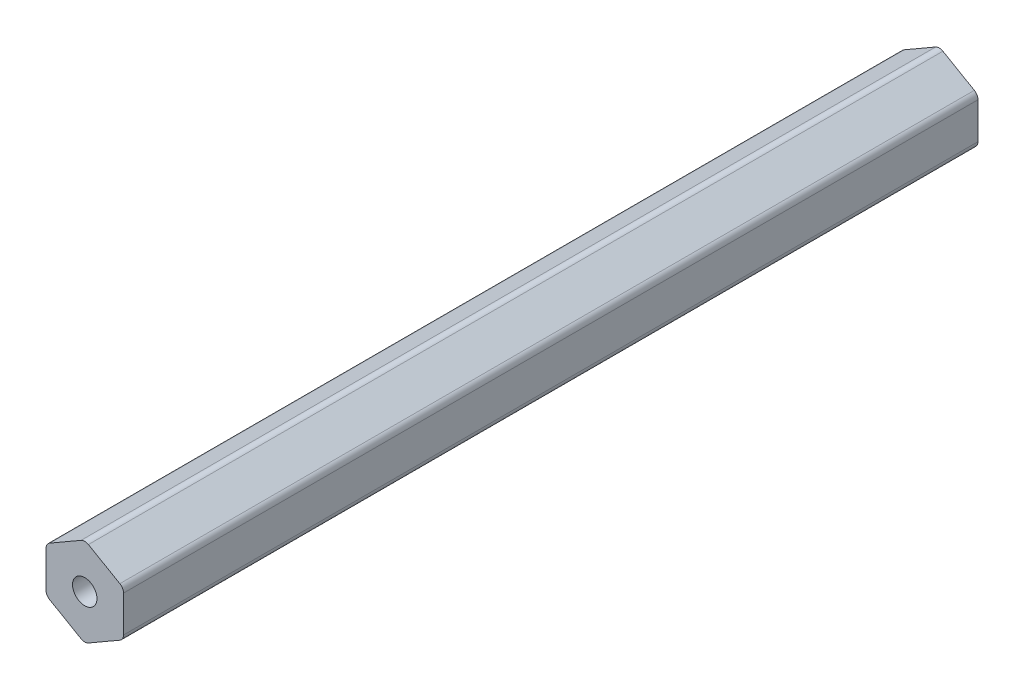
ISO-10303-21;
HEADER;
FILE_DESCRIPTION(('STEP AP214'),'2;1');
FILE_NAME('part.step','',(''),(''),'','','');
FILE_SCHEMA(('AUTOMOTIVE_DESIGN { 1 0 10303 214 1 1 1 1 }'));
ENDSEC;
DATA;
#1=APPLICATION_CONTEXT('core data for automotive mechanical design processes');
#2=APPLICATION_PROTOCOL_DEFINITION('international standard','automotive_design',2000,#1);
#3=PRODUCT_CONTEXT('',#1,'mechanical');
#4=PRODUCT('Part','Part','',(#3));
#5=PRODUCT_RELATED_PRODUCT_CATEGORY('part','',(#4));
#6=PRODUCT_DEFINITION_FORMATION('','',#4);
#7=PRODUCT_DEFINITION_CONTEXT('part definition',#1,'design');
#8=PRODUCT_DEFINITION('design','',#6,#7);
#9=PRODUCT_DEFINITION_SHAPE('','',#8);
#10=(LENGTH_UNIT() NAMED_UNIT(*) SI_UNIT(.MILLI.,.METRE.));
#11=(NAMED_UNIT(*) PLANE_ANGLE_UNIT() SI_UNIT($,.RADIAN.));
#12=(NAMED_UNIT(*) SI_UNIT($,.STERADIAN.) SOLID_ANGLE_UNIT());
#13=UNCERTAINTY_MEASURE_WITH_UNIT(LENGTH_MEASURE(1.E-05),#10,'distance_accuracy_value','');
#14=(GEOMETRIC_REPRESENTATION_CONTEXT(3) GLOBAL_UNCERTAINTY_ASSIGNED_CONTEXT((#13)) GLOBAL_UNIT_ASSIGNED_CONTEXT((#10,
#11,#12)) REPRESENTATION_CONTEXT('',''));
#15=CARTESIAN_POINT('',(0.,0.,0.));
#16=DIRECTION('',(0.,0.,1.));
#17=DIRECTION('',(1.,0.,0.));
#18=AXIS2_PLACEMENT_3D('',#15,#16,#17);
#19=CARTESIAN_POINT('',(-5.14999999999993,-2.97335388632662,140.));
#20=DIRECTION('',(0.,0.,1.));
#21=DIRECTION('',(1.,0.,0.));
#22=AXIS2_PLACEMENT_3D('',#19,#20,#21);
#23=PLANE('',#22);
#24=CARTESIAN_POINT('',(-5.14999999999993,-2.97335388632662,140.));
#25=DIRECTION('',(0.,0.,1.));
#26=DIRECTION('',(1.,0.,0.));
#27=AXIS2_PLACEMENT_3D('',#24,#25,#26);
#28=CIRCLE('',#27,1.2);
#29=CARTESIAN_POINT('',(-6.34999999999993,-2.97335388632663,140.));
#30=VERTEX_POINT('',#29);
#31=CARTESIAN_POINT('',(-5.74999999999992,-4.01258437086795,140.));
#32=VERTEX_POINT('',#31);
#33=EDGE_CURVE('E177',#30,#32,#28,.T.);
#34=ORIENTED_EDGE('',*,*,#33,.T.);
#35=DIRECTION('',(0.866025403784442,-0.499999999999995,0.));
#36=VECTOR('',#35,1.);
#37=CARTESIAN_POINT('',(-5.74999999999992,-4.01258437086795,140.));
#38=LINE('',#37,#36);
#39=CARTESIAN_POINT('',(-0.600000000000003,-6.98593825719444,140.));
#40=VERTEX_POINT('',#39);
#41=EDGE_CURVE('E105',#32,#40,#38,.T.);
#42=ORIENTED_EDGE('',*,*,#41,.T.);
#43=CARTESIAN_POINT('',(0.,-5.94670777265311,140.));
#44=DIRECTION('',(0.,0.,1.));
#45=DIRECTION('',(-1.,0.,0.));
#46=AXIS2_PLACEMENT_3D('',#43,#44,#45);
#47=CIRCLE('',#46,1.2);
#48=CARTESIAN_POINT('',(0.600000000000001,-6.98593825719443,140.));
#49=VERTEX_POINT('',#48);
#50=EDGE_CURVE('E204',#40,#49,#47,.T.);
#51=ORIENTED_EDGE('',*,*,#50,.T.);
#52=DIRECTION('',(0.866025403784438,0.500000000000001,0.));
#53=VECTOR('',#52,1.);
#54=CARTESIAN_POINT('',(0.600000000000001,-6.98593825719443,140.));
#55=LINE('',#54,#53);
#56=CARTESIAN_POINT('',(5.74999999999997,-4.01258437086787,140.));
#57=VERTEX_POINT('',#56);
#58=EDGE_CURVE('E223',#49,#57,#55,.T.);
#59=ORIENTED_EDGE('',*,*,#58,.T.);
#60=CARTESIAN_POINT('',(5.14999999999997,-2.97335388632654,140.));
#61=DIRECTION('',(0.,0.,1.));
#62=DIRECTION('',(1.,0.,0.));
#63=AXIS2_PLACEMENT_3D('',#60,#61,#62);
#64=CIRCLE('',#63,1.2);
#65=CARTESIAN_POINT('',(6.34999999999997,-2.97335388632653,140.));
#66=VERTEX_POINT('',#65);
#67=EDGE_CURVE('E220',#57,#66,#64,.T.);
#68=ORIENTED_EDGE('',*,*,#67,.T.);
#69=DIRECTION('',(0.,1.,0.));
#70=VECTOR('',#69,1.);
#71=CARTESIAN_POINT('',(6.34999999999997,-2.97335388632653,140.));
#72=LINE('',#71,#70);
#73=CARTESIAN_POINT('',(6.34999999999995,2.97335388632658,140.));
#74=VERTEX_POINT('',#73);
#75=EDGE_CURVE('E222',#66,#74,#72,.T.);
#76=ORIENTED_EDGE('',*,*,#75,.T.);
#77=CARTESIAN_POINT('',(5.14999999999995,2.97335388632658,140.));
#78=DIRECTION('',(0.,0.,1.));
#79=DIRECTION('',(1.,0.,0.));
#80=AXIS2_PLACEMENT_3D('',#77,#78,#79);
#81=CIRCLE('',#80,1.2);
#82=CARTESIAN_POINT('',(5.74999999999994,4.01258437086791,140.));
#83=VERTEX_POINT('',#82);
#84=EDGE_CURVE('E225',#74,#83,#81,.T.);
#85=ORIENTED_EDGE('',*,*,#84,.T.);
#86=DIRECTION('',(-0.866025403784441,0.499999999999995,0.));
#87=VECTOR('',#86,1.);
#88=CARTESIAN_POINT('',(5.74999999999994,4.01258437086791,140.));
#89=LINE('',#88,#87);
#90=CARTESIAN_POINT('',(0.599999999999957,6.98593825719444,140.));
#91=VERTEX_POINT('',#90);
#92=EDGE_CURVE('E231',#83,#91,#89,.T.);
#93=ORIENTED_EDGE('',*,*,#92,.T.);
#94=CARTESIAN_POINT('',(0.,5.94670777265311,140.));
#95=DIRECTION('',(0.,0.,1.));
#96=DIRECTION('',(1.,0.,0.));
#97=AXIS2_PLACEMENT_3D('',#94,#95,#96);
#98=CIRCLE('',#97,1.2);
#99=CARTESIAN_POINT('',(-0.600000000000055,6.98593825719443,140.));
#100=VERTEX_POINT('',#99);
#101=EDGE_CURVE('E136',#91,#100,#98,.T.);
#102=ORIENTED_EDGE('',*,*,#101,.T.);
#103=DIRECTION('',(-0.866025403784435,-0.500000000000007,0.));
#104=VECTOR('',#103,1.);
#105=CARTESIAN_POINT('',(-0.600000000000055,6.98593825719443,140.));
#106=LINE('',#105,#104);
#107=CARTESIAN_POINT('',(-5.75,4.01258437086783,140.));
#108=VERTEX_POINT('',#107);
#109=EDGE_CURVE('E130',#100,#108,#106,.T.);
#110=ORIENTED_EDGE('',*,*,#109,.T.);
#111=CARTESIAN_POINT('',(-5.15,2.97335388632651,140.));
#112=DIRECTION('',(0.,0.,1.));
#113=DIRECTION('',(1.,0.,0.));
#114=AXIS2_PLACEMENT_3D('',#111,#112,#113);
#115=CIRCLE('',#114,1.2);
#116=CARTESIAN_POINT('',(-6.35,2.97335388632649,140.));
#117=VERTEX_POINT('',#116);
#118=EDGE_CURVE('E134',#108,#117,#115,.T.);
#119=ORIENTED_EDGE('',*,*,#118,.T.);
#120=DIRECTION('',(0.,-1.,0.));
#121=VECTOR('',#120,1.);
#122=CARTESIAN_POINT('',(-6.35,2.97335388632649,140.));
#123=LINE('',#122,#121);
#124=EDGE_CURVE('E50',#117,#30,#123,.T.);
#125=ORIENTED_EDGE('',*,*,#124,.T.);
#126=EDGE_LOOP('',(#34,#42,#51,#59,#68,#76,#85,#93,#102,#110,#119,#125));
#127=FACE_BOUND('',#126,.T.);
#128=CARTESIAN_POINT('',(0.,0.,140.));
#129=DIRECTION('',(0.,0.,1.));
#130=DIRECTION('',(1.,0.,0.));
#131=AXIS2_PLACEMENT_3D('',#128,#129,#130);
#132=CIRCLE('',#131,2.);
#133=CARTESIAN_POINT('',(2.,0.,140.));
#134=VERTEX_POINT('',#133);
#135=EDGE_CURVE('E158',#134,#134,#132,.T.);
#136=ORIENTED_EDGE('',*,*,#135,.F.);
#137=EDGE_LOOP('',(#136));
#138=FACE_BOUND('',#137,.T.);
#139=ADVANCED_FACE('F33',(#127,#138),#23,.T.);
#140=CARTESIAN_POINT('',(-5.14999999999993,-2.97335388632662,0.));
#141=DIRECTION('',(0.,0.,1.));
#142=DIRECTION('',(1.,0.,0.));
#143=AXIS2_PLACEMENT_3D('',#140,#141,#142);
#144=PLANE('',#143);
#145=CARTESIAN_POINT('',(-5.14999999999993,-2.97335388632662,0.));
#146=DIRECTION('',(0.,0.,1.));
#147=DIRECTION('',(1.,0.,0.));
#148=AXIS2_PLACEMENT_3D('',#145,#146,#147);
#149=CIRCLE('',#148,1.2);
#150=CARTESIAN_POINT('',(-6.34999999999993,-2.97335388632663,0.));
#151=VERTEX_POINT('',#150);
#152=CARTESIAN_POINT('',(-5.74999999999992,-4.01258437086795,0.));
#153=VERTEX_POINT('',#152);
#154=EDGE_CURVE('E154',#151,#153,#149,.T.);
#155=ORIENTED_EDGE('',*,*,#154,.F.);
#156=DIRECTION('',(0.,-1.,0.));
#157=VECTOR('',#156,1.);
#158=CARTESIAN_POINT('',(-6.35,2.97335388632649,0.));
#159=LINE('',#158,#157);
#160=CARTESIAN_POINT('',(-6.35,2.97335388632649,0.));
#161=VERTEX_POINT('',#160);
#162=EDGE_CURVE('E97',#161,#151,#159,.T.);
#163=ORIENTED_EDGE('',*,*,#162,.F.);
#164=CARTESIAN_POINT('',(-5.15,2.97335388632651,0.));
#165=DIRECTION('',(0.,0.,1.));
#166=DIRECTION('',(1.,0.,0.));
#167=AXIS2_PLACEMENT_3D('',#164,#165,#166);
#168=CIRCLE('',#167,1.2);
#169=CARTESIAN_POINT('',(-5.75,4.01258437086783,0.));
#170=VERTEX_POINT('',#169);
#171=EDGE_CURVE('E91',#170,#161,#168,.T.);
#172=ORIENTED_EDGE('',*,*,#171,.F.);
#173=DIRECTION('',(-0.866025403784435,-0.500000000000007,0.));
#174=VECTOR('',#173,1.);
#175=CARTESIAN_POINT('',(-0.600000000000055,6.98593825719443,0.));
#176=LINE('',#175,#174);
#177=CARTESIAN_POINT('',(-0.600000000000055,6.98593825719443,0.));
#178=VERTEX_POINT('',#177);
#179=EDGE_CURVE('E144',#178,#170,#176,.T.);
#180=ORIENTED_EDGE('',*,*,#179,.F.);
#181=CARTESIAN_POINT('',(0.,5.94670777265311,0.));
#182=DIRECTION('',(0.,0.,1.));
#183=DIRECTION('',(1.,0.,0.));
#184=AXIS2_PLACEMENT_3D('',#181,#182,#183);
#185=CIRCLE('',#184,1.2);
#186=CARTESIAN_POINT('',(0.599999999999957,6.98593825719444,0.));
#187=VERTEX_POINT('',#186);
#188=EDGE_CURVE('E172',#187,#178,#185,.T.);
#189=ORIENTED_EDGE('',*,*,#188,.F.);
#190=DIRECTION('',(-0.866025403784441,0.499999999999995,0.));
#191=VECTOR('',#190,1.);
#192=CARTESIAN_POINT('',(5.74999999999994,4.01258437086791,0.));
#193=LINE('',#192,#191);
#194=CARTESIAN_POINT('',(5.74999999999994,4.01258437086791,0.));
#195=VERTEX_POINT('',#194);
#196=EDGE_CURVE('E170',#195,#187,#193,.T.);
#197=ORIENTED_EDGE('',*,*,#196,.F.);
#198=CARTESIAN_POINT('',(5.14999999999995,2.97335388632658,0.));
#199=DIRECTION('',(0.,0.,1.));
#200=DIRECTION('',(1.,0.,0.));
#201=AXIS2_PLACEMENT_3D('',#198,#199,#200);
#202=CIRCLE('',#201,1.2);
#203=CARTESIAN_POINT('',(6.34999999999995,2.97335388632658,0.));
#204=VERTEX_POINT('',#203);
#205=EDGE_CURVE('E168',#204,#195,#202,.T.);
#206=ORIENTED_EDGE('',*,*,#205,.F.);
#207=DIRECTION('',(0.,1.,0.));
#208=VECTOR('',#207,1.);
#209=CARTESIAN_POINT('',(6.34999999999997,-2.97335388632653,0.));
#210=LINE('',#209,#208);
#211=CARTESIAN_POINT('',(6.34999999999997,-2.97335388632653,0.));
#212=VERTEX_POINT('',#211);
#213=EDGE_CURVE('E166',#212,#204,#210,.T.);
#214=ORIENTED_EDGE('',*,*,#213,.F.);
#215=CARTESIAN_POINT('',(5.14999999999997,-2.97335388632654,0.));
#216=DIRECTION('',(0.,0.,1.));
#217=DIRECTION('',(1.,0.,0.));
#218=AXIS2_PLACEMENT_3D('',#215,#216,#217);
#219=CIRCLE('',#218,1.2);
#220=CARTESIAN_POINT('',(5.74999999999997,-4.01258437086787,0.));
#221=VERTEX_POINT('',#220);
#222=EDGE_CURVE('E164',#221,#212,#219,.T.);
#223=ORIENTED_EDGE('',*,*,#222,.F.);
#224=DIRECTION('',(0.866025403784438,0.500000000000001,0.));
#225=VECTOR('',#224,1.);
#226=CARTESIAN_POINT('',(0.600000000000001,-6.98593825719443,0.));
#227=LINE('',#226,#225);
#228=CARTESIAN_POINT('',(0.600000000000001,-6.98593825719443,0.));
#229=VERTEX_POINT('',#228);
#230=EDGE_CURVE('E162',#229,#221,#227,.T.);
#231=ORIENTED_EDGE('',*,*,#230,.F.);
#232=CARTESIAN_POINT('',(0.,-5.94670777265311,0.));
#233=DIRECTION('',(0.,0.,1.));
#234=DIRECTION('',(-1.,0.,0.));
#235=AXIS2_PLACEMENT_3D('',#232,#233,#234);
#236=CIRCLE('',#235,1.2);
#237=CARTESIAN_POINT('',(-0.600000000000003,-6.98593825719444,0.));
#238=VERTEX_POINT('',#237);
#239=EDGE_CURVE('E160',#238,#229,#236,.T.);
#240=ORIENTED_EDGE('',*,*,#239,.F.);
#241=DIRECTION('',(0.866025403784442,-0.499999999999995,0.));
#242=VECTOR('',#241,1.);
#243=CARTESIAN_POINT('',(-5.74999999999992,-4.01258437086795,0.));
#244=LINE('',#243,#242);
#245=EDGE_CURVE('E157',#153,#238,#244,.T.);
#246=ORIENTED_EDGE('',*,*,#245,.F.);
#247=EDGE_LOOP('',(#155,#163,#172,#180,#189,#197,#206,#214,#223,#231,#240,#246));
#248=FACE_BOUND('',#247,.T.);
#249=CARTESIAN_POINT('',(0.,0.,0.));
#250=DIRECTION('',(0.,0.,1.));
#251=DIRECTION('',(1.,0.,0.));
#252=AXIS2_PLACEMENT_3D('',#249,#250,#251);
#253=CIRCLE('',#252,2.);
#254=CARTESIAN_POINT('',(2.,0.,0.));
#255=VERTEX_POINT('',#254);
#256=EDGE_CURVE('E378',#255,#255,#253,.T.);
#257=ORIENTED_EDGE('',*,*,#256,.T.);
#258=EDGE_LOOP('',(#257));
#259=FACE_BOUND('',#258,.T.);
#260=ADVANCED_FACE('F208',(#248,#259),#144,.F.);
#261=CARTESIAN_POINT('',(-5.14999999999993,-2.97335388632662,140.));
#262=DIRECTION('',(0.,0.,-1.));
#263=DIRECTION('',(-1.,0.,0.));
#264=AXIS2_PLACEMENT_3D('',#261,#262,#263);
#265=CYLINDRICAL_SURFACE('',#264,1.2);
#266=ORIENTED_EDGE('',*,*,#154,.T.);
#267=DIRECTION('',(0.,0.,-1.));
#268=VECTOR('',#267,1.);
#269=CARTESIAN_POINT('',(-5.74999999999992,-4.01258437086795,140.));
#270=LINE('',#269,#268);
#271=EDGE_CURVE('E11',#32,#153,#270,.T.);
#272=ORIENTED_EDGE('',*,*,#271,.F.);
#273=ORIENTED_EDGE('',*,*,#33,.F.);
#274=DIRECTION('',(0.,0.,-1.));
#275=VECTOR('',#274,1.);
#276=CARTESIAN_POINT('',(-6.34999999999993,-2.97335388632663,140.));
#277=LINE('',#276,#275);
#278=EDGE_CURVE('E150',#30,#151,#277,.T.);
#279=ORIENTED_EDGE('',*,*,#278,.T.);
#280=EDGE_LOOP('',(#266,#272,#273,#279));
#281=FACE_BOUND('',#280,.T.);
#282=ADVANCED_FACE('F35',(#281),#265,.T.);
#283=CARTESIAN_POINT('',(-5.74999999999992,-4.01258437086795,140.));
#284=DIRECTION('',(0.499999999999995,0.866025403784442,0.));
#285=DIRECTION('',(-0.866025403784442,0.499999999999995,0.));
#286=AXIS2_PLACEMENT_3D('',#283,#284,#285);
#287=PLANE('',#286);
#288=ORIENTED_EDGE('',*,*,#245,.T.);
#289=DIRECTION('',(0.,0.,-1.));
#290=VECTOR('',#289,1.);
#291=CARTESIAN_POINT('',(-0.600000000000003,-6.98593825719444,140.));
#292=LINE('',#291,#290);
#293=EDGE_CURVE('E42',#40,#238,#292,.T.);
#294=ORIENTED_EDGE('',*,*,#293,.F.);
#295=ORIENTED_EDGE('',*,*,#41,.F.);
#296=ORIENTED_EDGE('',*,*,#271,.T.);
#297=EDGE_LOOP('',(#288,#294,#295,#296));
#298=FACE_BOUND('',#297,.T.);
#299=ADVANCED_FACE('F265',(#298),#287,.F.);
#300=CARTESIAN_POINT('',(0.,-5.94670777265311,140.));
#301=DIRECTION('',(0.,0.,-1.));
#302=DIRECTION('',(-1.,0.,0.));
#303=AXIS2_PLACEMENT_3D('',#300,#301,#302);
#304=CYLINDRICAL_SURFACE('',#303,1.2);
#305=ORIENTED_EDGE('',*,*,#239,.T.);
#306=DIRECTION('',(0.,0.,-1.));
#307=VECTOR('',#306,1.);
#308=CARTESIAN_POINT('',(0.600000000000001,-6.98593825719443,140.));
#309=LINE('',#308,#307);
#310=EDGE_CURVE('E196',#49,#229,#309,.T.);
#311=ORIENTED_EDGE('',*,*,#310,.F.);
#312=ORIENTED_EDGE('',*,*,#50,.F.);
#313=ORIENTED_EDGE('',*,*,#293,.T.);
#314=EDGE_LOOP('',(#305,#311,#312,#313));
#315=FACE_BOUND('',#314,.T.);
#316=ADVANCED_FACE('F202',(#315),#304,.T.);
#317=CARTESIAN_POINT('',(0.600000000000001,-6.98593825719443,140.));
#318=DIRECTION('',(-0.500000000000001,0.866025403784438,0.));
#319=DIRECTION('',(-0.866025403784438,-0.500000000000001,0.));
#320=AXIS2_PLACEMENT_3D('',#317,#318,#319);
#321=PLANE('',#320);
#322=ORIENTED_EDGE('',*,*,#230,.T.);
#323=DIRECTION('',(0.,0.,-1.));
#324=VECTOR('',#323,1.);
#325=CARTESIAN_POINT('',(5.74999999999997,-4.01258437086787,140.));
#326=LINE('',#325,#324);
#327=EDGE_CURVE('E193',#57,#221,#326,.T.);
#328=ORIENTED_EDGE('',*,*,#327,.F.);
#329=ORIENTED_EDGE('',*,*,#58,.F.);
#330=ORIENTED_EDGE('',*,*,#310,.T.);
#331=EDGE_LOOP('',(#322,#328,#329,#330));
#332=FACE_BOUND('',#331,.T.);
#333=ADVANCED_FACE('F214',(#332),#321,.F.);
#334=CARTESIAN_POINT('',(5.14999999999997,-2.97335388632654,140.));
#335=DIRECTION('',(0.,0.,-1.));
#336=DIRECTION('',(-1.,0.,0.));
#337=AXIS2_PLACEMENT_3D('',#334,#335,#336);
#338=CYLINDRICAL_SURFACE('',#337,1.2);
#339=ORIENTED_EDGE('',*,*,#222,.T.);
#340=DIRECTION('',(0.,0.,-1.));
#341=VECTOR('',#340,1.);
#342=CARTESIAN_POINT('',(6.34999999999997,-2.97335388632653,140.));
#343=LINE('',#342,#341);
#344=EDGE_CURVE('E190',#66,#212,#343,.T.);
#345=ORIENTED_EDGE('',*,*,#344,.F.);
#346=ORIENTED_EDGE('',*,*,#67,.F.);
#347=ORIENTED_EDGE('',*,*,#327,.T.);
#348=EDGE_LOOP('',(#339,#345,#346,#347));
#349=FACE_BOUND('',#348,.T.);
#350=ADVANCED_FACE('F218',(#349),#338,.T.);
#351=CARTESIAN_POINT('',(6.34999999999997,-2.97335388632653,140.));
#352=DIRECTION('',(-1.,0.,0.));
#353=DIRECTION('',(0.,-1.,0.));
#354=AXIS2_PLACEMENT_3D('',#351,#352,#353);
#355=PLANE('',#354);
#356=ORIENTED_EDGE('',*,*,#213,.T.);
#357=DIRECTION('',(0.,0.,-1.));
#358=VECTOR('',#357,1.);
#359=CARTESIAN_POINT('',(6.34999999999995,2.97335388632658,140.));
#360=LINE('',#359,#358);
#361=EDGE_CURVE('E187',#74,#204,#360,.T.);
#362=ORIENTED_EDGE('',*,*,#361,.F.);
#363=ORIENTED_EDGE('',*,*,#75,.F.);
#364=ORIENTED_EDGE('',*,*,#344,.T.);
#365=EDGE_LOOP('',(#356,#362,#363,#364));
#366=FACE_BOUND('',#365,.T.);
#367=ADVANCED_FACE('F278',(#366),#355,.F.);
#368=CARTESIAN_POINT('',(5.14999999999995,2.97335388632658,140.));
#369=DIRECTION('',(0.,0.,-1.));
#370=DIRECTION('',(-1.,0.,0.));
#371=AXIS2_PLACEMENT_3D('',#368,#369,#370);
#372=CYLINDRICAL_SURFACE('',#371,1.2);
#373=ORIENTED_EDGE('',*,*,#205,.T.);
#374=DIRECTION('',(0.,0.,-1.));
#375=VECTOR('',#374,1.);
#376=CARTESIAN_POINT('',(5.74999999999994,4.01258437086791,140.));
#377=LINE('',#376,#375);
#378=EDGE_CURVE('E184',#83,#195,#377,.T.);
#379=ORIENTED_EDGE('',*,*,#378,.F.);
#380=ORIENTED_EDGE('',*,*,#84,.F.);
#381=ORIENTED_EDGE('',*,*,#361,.T.);
#382=EDGE_LOOP('',(#373,#379,#380,#381));
#383=FACE_BOUND('',#382,.T.);
#384=ADVANCED_FACE('F281',(#383),#372,.T.);
#385=CARTESIAN_POINT('',(5.74999999999994,4.01258437086791,140.));
#386=DIRECTION('',(-0.499999999999995,-0.866025403784441,0.));
#387=DIRECTION('',(0.866025403784441,-0.499999999999995,0.));
#388=AXIS2_PLACEMENT_3D('',#385,#386,#387);
#389=PLANE('',#388);
#390=ORIENTED_EDGE('',*,*,#196,.T.);
#391=DIRECTION('',(0.,0.,-1.));
#392=VECTOR('',#391,1.);
#393=CARTESIAN_POINT('',(0.599999999999957,6.98593825719444,140.));
#394=LINE('',#393,#392);
#395=EDGE_CURVE('E181',#91,#187,#394,.T.);
#396=ORIENTED_EDGE('',*,*,#395,.F.);
#397=ORIENTED_EDGE('',*,*,#92,.F.);
#398=ORIENTED_EDGE('',*,*,#378,.T.);
#399=EDGE_LOOP('',(#390,#396,#397,#398));
#400=FACE_BOUND('',#399,.T.);
#401=ADVANCED_FACE('F237',(#400),#389,.F.);
#402=CARTESIAN_POINT('',(0.,5.94670777265311,140.));
#403=DIRECTION('',(0.,0.,-1.));
#404=DIRECTION('',(-1.,0.,0.));
#405=AXIS2_PLACEMENT_3D('',#402,#403,#404);
#406=CYLINDRICAL_SURFACE('',#405,1.2);
#407=ORIENTED_EDGE('',*,*,#188,.T.);
#408=DIRECTION('',(0.,0.,-1.));
#409=VECTOR('',#408,1.);
#410=CARTESIAN_POINT('',(-0.600000000000055,6.98593825719443,140.));
#411=LINE('',#410,#409);
#412=EDGE_CURVE('E145',#100,#178,#411,.T.);
#413=ORIENTED_EDGE('',*,*,#412,.F.);
#414=ORIENTED_EDGE('',*,*,#101,.F.);
#415=ORIENTED_EDGE('',*,*,#395,.T.);
#416=EDGE_LOOP('',(#407,#413,#414,#415));
#417=FACE_BOUND('',#416,.T.);
#418=ADVANCED_FACE('F241',(#417),#406,.T.);
#419=CARTESIAN_POINT('',(-0.600000000000055,6.98593825719443,140.));
#420=DIRECTION('',(0.500000000000007,-0.866025403784435,0.));
#421=DIRECTION('',(0.866025403784435,0.500000000000007,0.));
#422=AXIS2_PLACEMENT_3D('',#419,#420,#421);
#423=PLANE('',#422);
#424=ORIENTED_EDGE('',*,*,#179,.T.);
#425=DIRECTION('',(0.,0.,-1.));
#426=VECTOR('',#425,1.);
#427=CARTESIAN_POINT('',(-5.75,4.01258437086783,140.));
#428=LINE('',#427,#426);
#429=EDGE_CURVE('E141',#108,#170,#428,.T.);
#430=ORIENTED_EDGE('',*,*,#429,.F.);
#431=ORIENTED_EDGE('',*,*,#109,.F.);
#432=ORIENTED_EDGE('',*,*,#412,.T.);
#433=EDGE_LOOP('',(#424,#430,#431,#432));
#434=FACE_BOUND('',#433,.T.);
#435=ADVANCED_FACE('F142',(#434),#423,.F.);
#436=CARTESIAN_POINT('',(-5.15,2.97335388632651,140.));
#437=DIRECTION('',(0.,0.,-1.));
#438=DIRECTION('',(-1.,0.,0.));
#439=AXIS2_PLACEMENT_3D('',#436,#437,#438);
#440=CYLINDRICAL_SURFACE('',#439,1.2);
#441=ORIENTED_EDGE('',*,*,#171,.T.);
#442=DIRECTION('',(0.,0.,-1.));
#443=VECTOR('',#442,1.);
#444=CARTESIAN_POINT('',(-6.35,2.97335388632649,140.));
#445=LINE('',#444,#443);
#446=EDGE_CURVE('E146',#117,#161,#445,.T.);
#447=ORIENTED_EDGE('',*,*,#446,.F.);
#448=ORIENTED_EDGE('',*,*,#118,.F.);
#449=ORIENTED_EDGE('',*,*,#429,.T.);
#450=EDGE_LOOP('',(#441,#447,#448,#449));
#451=FACE_BOUND('',#450,.T.);
#452=ADVANCED_FACE('F148',(#451),#440,.T.);
#453=CARTESIAN_POINT('',(-6.35,2.97335388632649,140.));
#454=DIRECTION('',(1.,0.,0.));
#455=DIRECTION('',(0.,1.,0.));
#456=AXIS2_PLACEMENT_3D('',#453,#454,#455);
#457=PLANE('',#456);
#458=ORIENTED_EDGE('',*,*,#162,.T.);
#459=ORIENTED_EDGE('',*,*,#278,.F.);
#460=ORIENTED_EDGE('',*,*,#124,.F.);
#461=ORIENTED_EDGE('',*,*,#446,.T.);
#462=EDGE_LOOP('',(#458,#459,#460,#461));
#463=FACE_BOUND('',#462,.T.);
#464=ADVANCED_FACE('F245',(#463),#457,.F.);
#465=CARTESIAN_POINT('',(0.,0.,140.));
#466=DIRECTION('',(0.,0.,-1.));
#467=DIRECTION('',(-1.,0.,0.));
#468=AXIS2_PLACEMENT_3D('',#465,#466,#467);
#469=CYLINDRICAL_SURFACE('',#468,2.);
#470=ORIENTED_EDGE('',*,*,#135,.T.);
#471=EDGE_LOOP('',(#470));
#472=FACE_BOUND('',#471,.T.);
#473=ORIENTED_EDGE('',*,*,#256,.F.);
#474=EDGE_LOOP('',(#473));
#475=FACE_BOUND('',#474,.T.);
#476=ADVANCED_FACE('F247',(#472,#475),#469,.F.);
#477=CLOSED_SHELL('',(#139,#260,#282,#299,#316,#333,#350,#367,#384,#401,#418,#435,#452,#464,#476));
#478=MANIFOLD_SOLID_BREP('B2',#477);
#479=ADVANCED_BREP_SHAPE_REPRESENTATION('',(#18,#478),#14);
#480=SHAPE_DEFINITION_REPRESENTATION(#9,#479);
ENDSEC;
END-ISO-10303-21;
